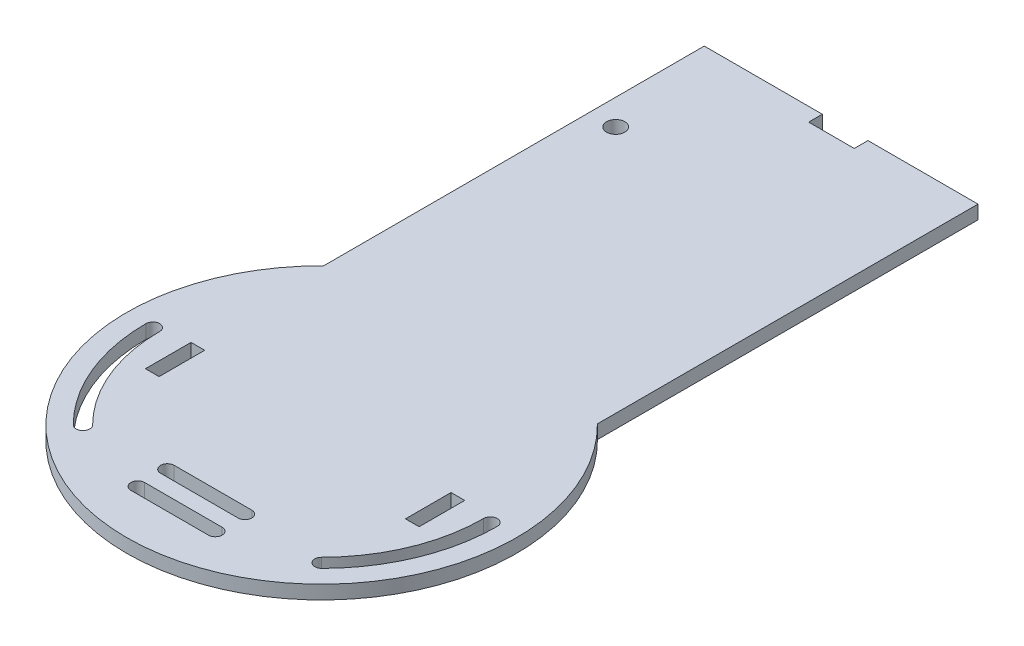
ISO-10303-21;
HEADER;
FILE_DESCRIPTION(('STEP AP214'),'2;1');
FILE_NAME('part.step','',(''),(''),'','','');
FILE_SCHEMA(('AUTOMOTIVE_DESIGN { 1 0 10303 214 1 1 1 1 }'));
ENDSEC;
DATA;
#1=APPLICATION_CONTEXT('core data for automotive mechanical design processes');
#2=APPLICATION_PROTOCOL_DEFINITION('international standard','automotive_design',2000,#1);
#3=PRODUCT_CONTEXT('',#1,'mechanical');
#4=PRODUCT('Part','Part','',(#3));
#5=PRODUCT_RELATED_PRODUCT_CATEGORY('part','',(#4));
#6=PRODUCT_DEFINITION_FORMATION('','',#4);
#7=PRODUCT_DEFINITION_CONTEXT('part definition',#1,'design');
#8=PRODUCT_DEFINITION('design','',#6,#7);
#9=PRODUCT_DEFINITION_SHAPE('','',#8);
#10=(LENGTH_UNIT() NAMED_UNIT(*) SI_UNIT(.MILLI.,.METRE.));
#11=(NAMED_UNIT(*) PLANE_ANGLE_UNIT() SI_UNIT($,.RADIAN.));
#12=(NAMED_UNIT(*) SI_UNIT($,.STERADIAN.) SOLID_ANGLE_UNIT());
#13=UNCERTAINTY_MEASURE_WITH_UNIT(LENGTH_MEASURE(1.E-05),#10,'distance_accuracy_value','');
#14=(GEOMETRIC_REPRESENTATION_CONTEXT(3) GLOBAL_UNCERTAINTY_ASSIGNED_CONTEXT((#13)) GLOBAL_UNIT_ASSIGNED_CONTEXT((#10,
#11,#12)) REPRESENTATION_CONTEXT('',''));
#15=CARTESIAN_POINT('',(0.,0.,0.));
#16=DIRECTION('',(0.,0.,1.));
#17=DIRECTION('',(1.,0.,0.));
#18=AXIS2_PLACEMENT_3D('',#15,#16,#17);
#19=CARTESIAN_POINT('',(0.0548478255462024,3.,51.3690634828703));
#20=DIRECTION('',(0.,1.,0.));
#21=DIRECTION('',(0.,0.,1.));
#22=AXIS2_PLACEMENT_3D('',#19,#20,#21);
#23=PLANE('',#22);
#24=CARTESIAN_POINT('',(0.0548478255462024,3.,51.3690634828703));
#25=DIRECTION('',(0.,1.,0.));
#26=DIRECTION('',(0.,0.,1.));
#27=AXIS2_PLACEMENT_3D('',#24,#25,#26);
#28=CIRCLE('',#27,38.5);
#29=CARTESIAN_POINT('',(27.2784589012284,3.,78.5926745585523));
#30=VERTEX_POINT('',#29);
#31=CARTESIAN_POINT('',(38.5548478255462,3.,51.3690634828703));
#32=VERTEX_POINT('',#31);
#33=EDGE_CURVE('E348',#30,#32,#28,.T.);
#34=ORIENTED_EDGE('',*,*,#33,.F.);
#35=CARTESIAN_POINT('',(26.2177987294486,3.,77.5320143867724));
#36=DIRECTION('',(0.,1.,0.));
#37=DIRECTION('',(0.,0.,1.));
#38=AXIS2_PLACEMENT_3D('',#35,#36,#37);
#39=CIRCLE('',#38,1.5);
#40=CARTESIAN_POINT('',(25.1571385576688,3.,76.4713542149926));
#41=VERTEX_POINT('',#40);
#42=EDGE_CURVE('E346',#41,#30,#39,.T.);
#43=ORIENTED_EDGE('',*,*,#42,.F.);
#44=CARTESIAN_POINT('',(0.0548478255462024,3.,51.3690634828703));
#45=DIRECTION('',(0.,-1.,0.));
#46=DIRECTION('',(0.,0.,1.));
#47=AXIS2_PLACEMENT_3D('',#44,#45,#46);
#48=CIRCLE('',#47,35.5);
#49=CARTESIAN_POINT('',(35.5548478255462,3.,51.3690634828703));
#50=VERTEX_POINT('',#49);
#51=EDGE_CURVE('E354',#50,#41,#48,.T.);
#52=ORIENTED_EDGE('',*,*,#51,.F.);
#53=CARTESIAN_POINT('',(37.0548478255462,3.,51.3690634828703));
#54=DIRECTION('',(0.,1.,0.));
#55=DIRECTION('',(0.,0.,1.));
#56=AXIS2_PLACEMENT_3D('',#53,#54,#55);
#57=CIRCLE('',#56,1.5);
#58=EDGE_CURVE('E351',#32,#50,#57,.T.);
#59=ORIENTED_EDGE('',*,*,#58,.F.);
#60=EDGE_LOOP('',(#34,#43,#52,#59));
#61=FACE_BOUND('',#60,.T.);
#62=DIRECTION('',(0.,0.,-1.));
#63=VECTOR('',#62,1.);
#64=CARTESIAN_POINT('',(-26.9451521744538,3.,60.));
#65=LINE('',#64,#63);
#66=CARTESIAN_POINT('',(-26.9451521744538,3.,60.));
#67=VERTEX_POINT('',#66);
#68=CARTESIAN_POINT('',(-26.9451521744538,3.,50.));
#69=VERTEX_POINT('',#68);
#70=EDGE_CURVE('E379',#67,#69,#65,.T.);
#71=ORIENTED_EDGE('',*,*,#70,.F.);
#72=DIRECTION('',(1.,0.,0.));
#73=VECTOR('',#72,1.);
#74=CARTESIAN_POINT('',(-26.9451521744538,3.,60.));
#75=LINE('',#74,#73);
#76=CARTESIAN_POINT('',(-29.9451521744538,3.,60.));
#77=VERTEX_POINT('',#76);
#78=EDGE_CURVE('E377',#77,#67,#75,.T.);
#79=ORIENTED_EDGE('',*,*,#78,.F.);
#80=DIRECTION('',(0.,0.,1.));
#81=VECTOR('',#80,1.);
#82=CARTESIAN_POINT('',(-29.9451521744538,3.,60.));
#83=LINE('',#82,#81);
#84=CARTESIAN_POINT('',(-29.9451521744538,3.,50.));
#85=VERTEX_POINT('',#84);
#86=EDGE_CURVE('E385',#85,#77,#83,.T.);
#87=ORIENTED_EDGE('',*,*,#86,.F.);
#88=DIRECTION('',(-1.,0.,0.));
#89=VECTOR('',#88,1.);
#90=CARTESIAN_POINT('',(-26.9451521744538,3.,50.));
#91=LINE('',#90,#89);
#92=EDGE_CURVE('E382',#69,#85,#91,.T.);
#93=ORIENTED_EDGE('',*,*,#92,.F.);
#94=EDGE_LOOP('',(#71,#79,#87,#93));
#95=FACE_BOUND('',#94,.T.);
#96=DIRECTION('',(-1.,0.,0.));
#97=VECTOR('',#96,1.);
#98=CARTESIAN_POINT('',(30.0548478255454,3.,50.));
#99=LINE('',#98,#97);
#100=CARTESIAN_POINT('',(30.0548478255454,3.,50.));
#101=VERTEX_POINT('',#100);
#102=CARTESIAN_POINT('',(27.0548478255454,3.,50.));
#103=VERTEX_POINT('',#102);
#104=EDGE_CURVE('E410',#101,#103,#99,.T.);
#105=ORIENTED_EDGE('',*,*,#104,.F.);
#106=DIRECTION('',(0.,0.,-1.));
#107=VECTOR('',#106,1.);
#108=CARTESIAN_POINT('',(30.0548478255454,3.,60.));
#109=LINE('',#108,#107);
#110=CARTESIAN_POINT('',(30.0548478255454,3.,60.));
#111=VERTEX_POINT('',#110);
#112=EDGE_CURVE('E408',#111,#101,#109,.T.);
#113=ORIENTED_EDGE('',*,*,#112,.F.);
#114=DIRECTION('',(1.,0.,0.));
#115=VECTOR('',#114,1.);
#116=CARTESIAN_POINT('',(30.0548478255454,3.,60.));
#117=LINE('',#116,#115);
#118=CARTESIAN_POINT('',(27.0548478255454,3.,60.));
#119=VERTEX_POINT('',#118);
#120=EDGE_CURVE('E416',#119,#111,#117,.T.);
#121=ORIENTED_EDGE('',*,*,#120,.F.);
#122=DIRECTION('',(0.,0.,1.));
#123=VECTOR('',#122,1.);
#124=CARTESIAN_POINT('',(27.0548478255454,3.,60.));
#125=LINE('',#124,#123);
#126=EDGE_CURVE('E413',#103,#119,#125,.T.);
#127=ORIENTED_EDGE('',*,*,#126,.F.);
#128=EDGE_LOOP('',(#105,#113,#121,#127));
#129=FACE_BOUND('',#128,.T.);
#130=DIRECTION('',(-1.,0.,0.));
#131=VECTOR('',#130,1.);
#132=CARTESIAN_POINT('',(5.93086457862568,3.,-62.5));
#133=LINE('',#132,#131);
#134=CARTESIAN_POINT('',(30.0548478255462,3.,-62.5));
#135=VERTEX_POINT('',#134);
#136=CARTESIAN_POINT('',(5.93086457862568,3.,-62.5));
#137=VERTEX_POINT('',#136);
#138=EDGE_CURVE('E439',#135,#137,#133,.T.);
#139=ORIENTED_EDGE('',*,*,#138,.T.);
#140=DIRECTION('',(0.,0.,1.));
#141=VECTOR('',#140,1.);
#142=CARTESIAN_POINT('',(5.93086457862568,3.,-62.5));
#143=LINE('',#142,#141);
#144=CARTESIAN_POINT('',(5.93086457862568,3.,-59.5));
#145=VERTEX_POINT('',#144);
#146=EDGE_CURVE('E442',#137,#145,#143,.T.);
#147=ORIENTED_EDGE('',*,*,#146,.T.);
#148=DIRECTION('',(-1.,0.,0.));
#149=VECTOR('',#148,1.);
#150=CARTESIAN_POINT('',(5.93086457862568,3.,-59.5));
#151=LINE('',#150,#149);
#152=CARTESIAN_POINT('',(-4.0691354213743,3.,-59.5));
#153=VERTEX_POINT('',#152);
#154=EDGE_CURVE('E445',#145,#153,#151,.T.);
#155=ORIENTED_EDGE('',*,*,#154,.T.);
#156=DIRECTION('',(0.,0.,-1.));
#157=VECTOR('',#156,1.);
#158=CARTESIAN_POINT('',(-4.0691354213743,3.,-62.5));
#159=LINE('',#158,#157);
#160=CARTESIAN_POINT('',(-4.0691354213743,3.,-62.5));
#161=VERTEX_POINT('',#160);
#162=EDGE_CURVE('E447',#153,#161,#159,.T.);
#163=ORIENTED_EDGE('',*,*,#162,.T.);
#164=DIRECTION('',(-1.,0.,0.));
#165=VECTOR('',#164,1.);
#166=CARTESIAN_POINT('',(-29.9451521744538,3.,-62.5));
#167=LINE('',#166,#165);
#168=CARTESIAN_POINT('',(-29.9451521744538,3.,-62.5));
#169=VERTEX_POINT('',#168);
#170=EDGE_CURVE('E449',#161,#169,#167,.T.);
#171=ORIENTED_EDGE('',*,*,#170,.T.);
#172=DIRECTION('',(0.,0.,1.));
#173=VECTOR('',#172,1.);
#174=CARTESIAN_POINT('',(-29.9451521744538,3.,20.9241988671145));
#175=LINE('',#174,#173);
#176=CARTESIAN_POINT('',(-29.9451521744538,3.,20.9241988671145));
#177=VERTEX_POINT('',#176);
#178=EDGE_CURVE('E451',#169,#177,#175,.T.);
#179=ORIENTED_EDGE('',*,*,#178,.T.);
#180=CARTESIAN_POINT('',(0.0548478255462024,3.,51.3690634828703));
#181=DIRECTION('',(0.,1.,0.));
#182=DIRECTION('',(0.,0.,1.));
#183=AXIS2_PLACEMENT_3D('',#180,#181,#182);
#184=CIRCLE('',#183,42.7421312228544);
#185=CARTESIAN_POINT('',(30.0548478255462,3.,20.9241988671145));
#186=VERTEX_POINT('',#185);
#187=EDGE_CURVE('E453',#177,#186,#184,.T.);
#188=ORIENTED_EDGE('',*,*,#187,.T.);
#189=DIRECTION('',(0.,0.,-1.));
#190=VECTOR('',#189,1.);
#191=CARTESIAN_POINT('',(30.0548478255462,3.,20.9241988671145));
#192=LINE('',#191,#190);
#193=EDGE_CURVE('E455',#186,#135,#192,.T.);
#194=ORIENTED_EDGE('',*,*,#193,.T.);
#195=EDGE_LOOP('',(#139,#147,#155,#163,#171,#179,#188,#194));
#196=FACE_BOUND('',#195,.T.);
#197=CARTESIAN_POINT('',(-24.3,3.,-37.4391816326505));
#198=DIRECTION('',(0.,1.,0.));
#199=DIRECTION('',(0.,0.,1.));
#200=AXIS2_PLACEMENT_3D('',#197,#198,#199);
#201=CIRCLE('',#200,2.);
#202=CARTESIAN_POINT('',(-24.3,3.,-35.4391816326505));
#203=VERTEX_POINT('',#202);
#204=EDGE_CURVE('E340',#203,#203,#201,.T.);
#205=ORIENTED_EDGE('',*,*,#204,.F.);
#206=EDGE_LOOP('',(#205));
#207=FACE_BOUND('',#206,.T.);
#208=CARTESIAN_POINT('',(0.0548478255462024,3.,51.3690634828703));
#209=DIRECTION('',(0.,-1.,0.));
#210=DIRECTION('',(0.,0.,1.));
#211=AXIS2_PLACEMENT_3D('',#208,#209,#210);
#212=CIRCLE('',#211,35.5);
#213=CARTESIAN_POINT('',(-25.0474429065764,3.,76.4713542149926));
#214=VERTEX_POINT('',#213);
#215=CARTESIAN_POINT('',(-35.4451521744538,3.,51.3690634828703));
#216=VERTEX_POINT('',#215);
#217=EDGE_CURVE('E311',#214,#216,#212,.T.);
#218=ORIENTED_EDGE('',*,*,#217,.F.);
#219=CARTESIAN_POINT('',(-26.1081030783562,3.,77.5320143867724));
#220=DIRECTION('',(0.,1.,0.));
#221=DIRECTION('',(0.,0.,1.));
#222=AXIS2_PLACEMENT_3D('',#219,#220,#221);
#223=CIRCLE('',#222,1.5);
#224=CARTESIAN_POINT('',(-27.168763250136,3.,78.5926745585522));
#225=VERTEX_POINT('',#224);
#226=EDGE_CURVE('E309',#225,#214,#223,.T.);
#227=ORIENTED_EDGE('',*,*,#226,.F.);
#228=CARTESIAN_POINT('',(0.0548478255462024,3.,51.3690634828703));
#229=DIRECTION('',(0.,1.,0.));
#230=DIRECTION('',(0.,0.,1.));
#231=AXIS2_PLACEMENT_3D('',#228,#229,#230);
#232=CIRCLE('',#231,38.5);
#233=CARTESIAN_POINT('',(-38.4451521744538,3.,51.3690634828703));
#234=VERTEX_POINT('',#233);
#235=EDGE_CURVE('E317',#234,#225,#232,.T.);
#236=ORIENTED_EDGE('',*,*,#235,.F.);
#237=CARTESIAN_POINT('',(-36.9451521744538,3.,51.3690634828703));
#238=DIRECTION('',(0.,1.,0.));
#239=DIRECTION('',(0.,0.,1.));
#240=AXIS2_PLACEMENT_3D('',#237,#238,#239);
#241=CIRCLE('',#240,1.5);
#242=EDGE_CURVE('E314',#216,#234,#241,.T.);
#243=ORIENTED_EDGE('',*,*,#242,.F.);
#244=EDGE_LOOP('',(#218,#227,#236,#243));
#245=FACE_BOUND('',#244,.T.);
#246=DIRECTION('',(-1.,0.,0.));
#247=VECTOR('',#246,1.);
#248=CARTESIAN_POINT('',(8.55484782554621,3.,81.6826233576801));
#249=LINE('',#248,#247);
#250=CARTESIAN_POINT('',(8.55484782554621,3.,81.6826233576801));
#251=VERTEX_POINT('',#250);
#252=CARTESIAN_POINT('',(-8.4451521744538,3.,81.6826233576801));
#253=VERTEX_POINT('',#252);
#254=EDGE_CURVE('E280',#251,#253,#249,.T.);
#255=ORIENTED_EDGE('',*,*,#254,.F.);
#256=CARTESIAN_POINT('',(8.5548478255462,3.,83.1826233576801));
#257=DIRECTION('',(0.,1.,0.));
#258=DIRECTION('',(0.,0.,1.));
#259=AXIS2_PLACEMENT_3D('',#256,#257,#258);
#260=CIRCLE('',#259,1.5);
#261=CARTESIAN_POINT('',(8.55484782554621,3.,84.6826233576801));
#262=VERTEX_POINT('',#261);
#263=EDGE_CURVE('E278',#262,#251,#260,.T.);
#264=ORIENTED_EDGE('',*,*,#263,.F.);
#265=DIRECTION('',(1.,0.,0.));
#266=VECTOR('',#265,1.);
#267=CARTESIAN_POINT('',(-8.4451521744538,3.,84.6826233576801));
#268=LINE('',#267,#266);
#269=CARTESIAN_POINT('',(-8.4451521744538,3.,84.6826233576801));
#270=VERTEX_POINT('',#269);
#271=EDGE_CURVE('E286',#270,#262,#268,.T.);
#272=ORIENTED_EDGE('',*,*,#271,.F.);
#273=CARTESIAN_POINT('',(-8.4451521744538,3.,83.1826233576801));
#274=DIRECTION('',(0.,1.,0.));
#275=DIRECTION('',(0.,0.,1.));
#276=AXIS2_PLACEMENT_3D('',#273,#274,#275);
#277=CIRCLE('',#276,1.5);
#278=EDGE_CURVE('E283',#253,#270,#277,.T.);
#279=ORIENTED_EDGE('',*,*,#278,.F.);
#280=EDGE_LOOP('',(#255,#264,#272,#279));
#281=FACE_BOUND('',#280,.T.);
#282=DIRECTION('',(-1.,0.,0.));
#283=VECTOR('',#282,1.);
#284=CARTESIAN_POINT('',(8.55484782554621,3.,75.1826233576801));
#285=LINE('',#284,#283);
#286=CARTESIAN_POINT('',(8.55484782554621,3.,75.1826233576801));
#287=VERTEX_POINT('',#286);
#288=CARTESIAN_POINT('',(-8.44515217445379,3.,75.1826233576801));
#289=VERTEX_POINT('',#288);
#290=EDGE_CURVE('E250',#287,#289,#285,.T.);
#291=ORIENTED_EDGE('',*,*,#290,.F.);
#292=CARTESIAN_POINT('',(8.55484782554621,3.,76.6826233576801));
#293=DIRECTION('',(0.,1.,0.));
#294=DIRECTION('',(0.,0.,1.));
#295=AXIS2_PLACEMENT_3D('',#292,#293,#294);
#296=CIRCLE('',#295,1.5);
#297=CARTESIAN_POINT('',(8.55484782554621,3.,78.1826233576801));
#298=VERTEX_POINT('',#297);
#299=EDGE_CURVE('E242',#298,#287,#296,.T.);
#300=ORIENTED_EDGE('',*,*,#299,.F.);
#301=DIRECTION('',(1.,0.,0.));
#302=VECTOR('',#301,1.);
#303=CARTESIAN_POINT('',(-8.44515217445379,3.,78.1826233576801));
#304=LINE('',#303,#302);
#305=CARTESIAN_POINT('',(-8.44515217445379,3.,78.1826233576801));
#306=VERTEX_POINT('',#305);
#307=EDGE_CURVE('E264',#306,#298,#304,.T.);
#308=ORIENTED_EDGE('',*,*,#307,.F.);
#309=CARTESIAN_POINT('',(-8.44515217445379,3.,76.6826233576801));
#310=DIRECTION('',(0.,1.,0.));
#311=DIRECTION('',(0.,0.,1.));
#312=AXIS2_PLACEMENT_3D('',#309,#310,#311);
#313=CIRCLE('',#312,1.5);
#314=EDGE_CURVE('E262',#289,#306,#313,.T.);
#315=ORIENTED_EDGE('',*,*,#314,.F.);
#316=EDGE_LOOP('',(#291,#300,#308,#315));
#317=FACE_BOUND('',#316,.T.);
#318=ADVANCED_FACE('F33',(#61,#95,#129,#196,#207,#245,#281,#317),#23,.T.);
#319=CARTESIAN_POINT('',(0.0548478255462024,0.,51.3690634828703));
#320=DIRECTION('',(0.,1.,0.));
#321=DIRECTION('',(0.,0.,1.));
#322=AXIS2_PLACEMENT_3D('',#319,#320,#321);
#323=PLANE('',#322);
#324=CARTESIAN_POINT('',(8.5548478255462,0.,83.1826233576801));
#325=DIRECTION('',(0.,1.,0.));
#326=DIRECTION('',(0.,0.,1.));
#327=AXIS2_PLACEMENT_3D('',#324,#325,#326);
#328=CIRCLE('',#327,1.5);
#329=CARTESIAN_POINT('',(8.55484782554621,0.,84.6826233576801));
#330=VERTEX_POINT('',#329);
#331=CARTESIAN_POINT('',(8.55484782554621,0.,81.6826233576801));
#332=VERTEX_POINT('',#331);
#333=EDGE_CURVE('E258',#330,#332,#328,.T.);
#334=ORIENTED_EDGE('',*,*,#333,.T.);
#335=DIRECTION('',(-1.,0.,0.));
#336=VECTOR('',#335,1.);
#337=CARTESIAN_POINT('',(8.55484782554621,0.,81.6826233576801));
#338=LINE('',#337,#336);
#339=CARTESIAN_POINT('',(-8.4451521744538,0.,81.6826233576801));
#340=VERTEX_POINT('',#339);
#341=EDGE_CURVE('E291',#332,#340,#338,.T.);
#342=ORIENTED_EDGE('',*,*,#341,.T.);
#343=CARTESIAN_POINT('',(-8.4451521744538,0.,83.1826233576801));
#344=DIRECTION('',(0.,1.,0.));
#345=DIRECTION('',(0.,0.,1.));
#346=AXIS2_PLACEMENT_3D('',#343,#344,#345);
#347=CIRCLE('',#346,1.5);
#348=CARTESIAN_POINT('',(-8.4451521744538,0.,84.6826233576801));
#349=VERTEX_POINT('',#348);
#350=EDGE_CURVE('E294',#340,#349,#347,.T.);
#351=ORIENTED_EDGE('',*,*,#350,.T.);
#352=DIRECTION('',(1.,0.,0.));
#353=VECTOR('',#352,1.);
#354=CARTESIAN_POINT('',(-8.4451521744538,0.,84.6826233576801));
#355=LINE('',#354,#353);
#356=EDGE_CURVE('E281',#349,#330,#355,.T.);
#357=ORIENTED_EDGE('',*,*,#356,.T.);
#358=EDGE_LOOP('',(#334,#342,#351,#357));
#359=FACE_BOUND('',#358,.T.);
#360=CARTESIAN_POINT('',(-24.3,0.,-37.4391816326505));
#361=DIRECTION('',(0.,1.,0.));
#362=DIRECTION('',(0.,0.,1.));
#363=AXIS2_PLACEMENT_3D('',#360,#361,#362);
#364=CIRCLE('',#363,2.);
#365=CARTESIAN_POINT('',(-24.3,0.,-35.4391816326505));
#366=VERTEX_POINT('',#365);
#367=EDGE_CURVE('E339',#366,#366,#364,.T.);
#368=ORIENTED_EDGE('',*,*,#367,.T.);
#369=EDGE_LOOP('',(#368));
#370=FACE_BOUND('',#369,.T.);
#371=CARTESIAN_POINT('',(26.2177987294486,0.,77.5320143867724));
#372=DIRECTION('',(0.,1.,0.));
#373=DIRECTION('',(0.,0.,1.));
#374=AXIS2_PLACEMENT_3D('',#371,#372,#373);
#375=CIRCLE('',#374,1.5);
#376=CARTESIAN_POINT('',(25.1571385576688,0.,76.4713542149926));
#377=VERTEX_POINT('',#376);
#378=CARTESIAN_POINT('',(27.2784589012284,0.,78.5926745585523));
#379=VERTEX_POINT('',#378);
#380=EDGE_CURVE('E343',#377,#379,#375,.T.);
#381=ORIENTED_EDGE('',*,*,#380,.T.);
#382=CARTESIAN_POINT('',(0.0548478255462024,0.,51.3690634828703));
#383=DIRECTION('',(0.,1.,0.));
#384=DIRECTION('',(0.,0.,1.));
#385=AXIS2_PLACEMENT_3D('',#382,#383,#384);
#386=CIRCLE('',#385,38.5);
#387=CARTESIAN_POINT('',(38.5548478255462,0.,51.3690634828703));
#388=VERTEX_POINT('',#387);
#389=EDGE_CURVE('E359',#379,#388,#386,.T.);
#390=ORIENTED_EDGE('',*,*,#389,.T.);
#391=CARTESIAN_POINT('',(37.0548478255462,0.,51.3690634828703));
#392=DIRECTION('',(0.,1.,0.));
#393=DIRECTION('',(0.,0.,1.));
#394=AXIS2_PLACEMENT_3D('',#391,#392,#393);
#395=CIRCLE('',#394,1.5);
#396=CARTESIAN_POINT('',(35.5548478255462,0.,51.3690634828703));
#397=VERTEX_POINT('',#396);
#398=EDGE_CURVE('E362',#388,#397,#395,.T.);
#399=ORIENTED_EDGE('',*,*,#398,.T.);
#400=CARTESIAN_POINT('',(0.0548478255462024,0.,51.3690634828703));
#401=DIRECTION('',(0.,-1.,0.));
#402=DIRECTION('',(0.,0.,1.));
#403=AXIS2_PLACEMENT_3D('',#400,#401,#402);
#404=CIRCLE('',#403,35.5);
#405=EDGE_CURVE('E349',#397,#377,#404,.T.);
#406=ORIENTED_EDGE('',*,*,#405,.T.);
#407=EDGE_LOOP('',(#381,#390,#399,#406));
#408=FACE_BOUND('',#407,.T.);
#409=DIRECTION('',(0.,0.,-1.));
#410=VECTOR('',#409,1.);
#411=CARTESIAN_POINT('',(30.0548478255454,0.,60.));
#412=LINE('',#411,#410);
#413=CARTESIAN_POINT('',(30.0548478255454,0.,60.));
#414=VERTEX_POINT('',#413);
#415=CARTESIAN_POINT('',(30.0548478255454,0.,50.));
#416=VERTEX_POINT('',#415);
#417=EDGE_CURVE('E407',#414,#416,#412,.T.);
#418=ORIENTED_EDGE('',*,*,#417,.T.);
#419=DIRECTION('',(-1.,0.,0.));
#420=VECTOR('',#419,1.);
#421=CARTESIAN_POINT('',(30.0548478255454,0.,50.));
#422=LINE('',#421,#420);
#423=CARTESIAN_POINT('',(27.0548478255454,0.,50.));
#424=VERTEX_POINT('',#423);
#425=EDGE_CURVE('E421',#416,#424,#422,.T.);
#426=ORIENTED_EDGE('',*,*,#425,.T.);
#427=DIRECTION('',(0.,0.,1.));
#428=VECTOR('',#427,1.);
#429=CARTESIAN_POINT('',(27.0548478255454,0.,60.));
#430=LINE('',#429,#428);
#431=CARTESIAN_POINT('',(27.0548478255454,0.,60.));
#432=VERTEX_POINT('',#431);
#433=EDGE_CURVE('E424',#424,#432,#430,.T.);
#434=ORIENTED_EDGE('',*,*,#433,.T.);
#435=DIRECTION('',(1.,0.,0.));
#436=VECTOR('',#435,1.);
#437=CARTESIAN_POINT('',(30.0548478255454,0.,60.));
#438=LINE('',#437,#436);
#439=EDGE_CURVE('E411',#432,#414,#438,.T.);
#440=ORIENTED_EDGE('',*,*,#439,.T.);
#441=EDGE_LOOP('',(#418,#426,#434,#440));
#442=FACE_BOUND('',#441,.T.);
#443=DIRECTION('',(-1.,0.,0.));
#444=VECTOR('',#443,1.);
#445=CARTESIAN_POINT('',(5.93086457862568,0.,-62.5));
#446=LINE('',#445,#444);
#447=CARTESIAN_POINT('',(30.0548478255462,0.,-62.5));
#448=VERTEX_POINT('',#447);
#449=CARTESIAN_POINT('',(5.93086457862568,0.,-62.5));
#450=VERTEX_POINT('',#449);
#451=EDGE_CURVE('E438',#448,#450,#446,.T.);
#452=ORIENTED_EDGE('',*,*,#451,.F.);
#453=DIRECTION('',(0.,0.,-1.));
#454=VECTOR('',#453,1.);
#455=CARTESIAN_POINT('',(30.0548478255462,0.,20.9241988671145));
#456=LINE('',#455,#454);
#457=CARTESIAN_POINT('',(30.0548478255462,0.,20.9241988671145));
#458=VERTEX_POINT('',#457);
#459=EDGE_CURVE('E443',#458,#448,#456,.T.);
#460=ORIENTED_EDGE('',*,*,#459,.F.);
#461=CARTESIAN_POINT('',(0.0548478255462024,0.,51.3690634828703));
#462=DIRECTION('',(0.,1.,0.));
#463=DIRECTION('',(0.,0.,1.));
#464=AXIS2_PLACEMENT_3D('',#461,#462,#463);
#465=CIRCLE('',#464,42.7421312228544);
#466=CARTESIAN_POINT('',(-29.9451521744538,0.,20.9241988671145));
#467=VERTEX_POINT('',#466);
#468=EDGE_CURVE('E470',#467,#458,#465,.T.);
#469=ORIENTED_EDGE('',*,*,#468,.F.);
#470=DIRECTION('',(0.,0.,1.));
#471=VECTOR('',#470,1.);
#472=CARTESIAN_POINT('',(-29.9451521744538,0.,20.9241988671145));
#473=LINE('',#472,#471);
#474=CARTESIAN_POINT('',(-29.9451521744538,0.,-62.5));
#475=VERTEX_POINT('',#474);
#476=EDGE_CURVE('E468',#475,#467,#473,.T.);
#477=ORIENTED_EDGE('',*,*,#476,.F.);
#478=DIRECTION('',(-1.,0.,0.));
#479=VECTOR('',#478,1.);
#480=CARTESIAN_POINT('',(-29.9451521744538,0.,-62.5));
#481=LINE('',#480,#479);
#482=CARTESIAN_POINT('',(-4.0691354213743,0.,-62.5));
#483=VERTEX_POINT('',#482);
#484=EDGE_CURVE('E466',#483,#475,#481,.T.);
#485=ORIENTED_EDGE('',*,*,#484,.F.);
#486=DIRECTION('',(0.,0.,-1.));
#487=VECTOR('',#486,1.);
#488=CARTESIAN_POINT('',(-4.0691354213743,0.,-62.5));
#489=LINE('',#488,#487);
#490=CARTESIAN_POINT('',(-4.0691354213743,0.,-59.5));
#491=VERTEX_POINT('',#490);
#492=EDGE_CURVE('E464',#491,#483,#489,.T.);
#493=ORIENTED_EDGE('',*,*,#492,.F.);
#494=DIRECTION('',(-1.,0.,0.));
#495=VECTOR('',#494,1.);
#496=CARTESIAN_POINT('',(5.93086457862568,0.,-59.5));
#497=LINE('',#496,#495);
#498=CARTESIAN_POINT('',(5.93086457862568,0.,-59.5));
#499=VERTEX_POINT('',#498);
#500=EDGE_CURVE('E462',#499,#491,#497,.T.);
#501=ORIENTED_EDGE('',*,*,#500,.F.);
#502=DIRECTION('',(0.,0.,1.));
#503=VECTOR('',#502,1.);
#504=CARTESIAN_POINT('',(5.93086457862568,0.,-62.5));
#505=LINE('',#504,#503);
#506=EDGE_CURVE('E460',#450,#499,#505,.T.);
#507=ORIENTED_EDGE('',*,*,#506,.F.);
#508=EDGE_LOOP('',(#452,#460,#469,#477,#485,#493,#501,#507));
#509=FACE_BOUND('',#508,.T.);
#510=DIRECTION('',(1.,0.,0.));
#511=VECTOR('',#510,1.);
#512=CARTESIAN_POINT('',(-26.9451521744538,0.,60.));
#513=LINE('',#512,#511);
#514=CARTESIAN_POINT('',(-29.9451521744538,0.,60.));
#515=VERTEX_POINT('',#514);
#516=CARTESIAN_POINT('',(-26.9451521744538,0.,60.));
#517=VERTEX_POINT('',#516);
#518=EDGE_CURVE('E376',#515,#517,#513,.T.);
#519=ORIENTED_EDGE('',*,*,#518,.T.);
#520=DIRECTION('',(0.,0.,-1.));
#521=VECTOR('',#520,1.);
#522=CARTESIAN_POINT('',(-26.9451521744538,0.,60.));
#523=LINE('',#522,#521);
#524=CARTESIAN_POINT('',(-26.9451521744538,0.,50.));
#525=VERTEX_POINT('',#524);
#526=EDGE_CURVE('E390',#517,#525,#523,.T.);
#527=ORIENTED_EDGE('',*,*,#526,.T.);
#528=DIRECTION('',(-1.,0.,0.));
#529=VECTOR('',#528,1.);
#530=CARTESIAN_POINT('',(-26.9451521744538,0.,50.));
#531=LINE('',#530,#529);
#532=CARTESIAN_POINT('',(-29.9451521744538,0.,50.));
#533=VERTEX_POINT('',#532);
#534=EDGE_CURVE('E393',#525,#533,#531,.T.);
#535=ORIENTED_EDGE('',*,*,#534,.T.);
#536=DIRECTION('',(0.,0.,1.));
#537=VECTOR('',#536,1.);
#538=CARTESIAN_POINT('',(-29.9451521744538,0.,60.));
#539=LINE('',#538,#537);
#540=EDGE_CURVE('E380',#533,#515,#539,.T.);
#541=ORIENTED_EDGE('',*,*,#540,.T.);
#542=EDGE_LOOP('',(#519,#527,#535,#541));
#543=FACE_BOUND('',#542,.T.);
#544=CARTESIAN_POINT('',(-26.1081030783562,0.,77.5320143867724));
#545=DIRECTION('',(0.,1.,0.));
#546=DIRECTION('',(0.,0.,1.));
#547=AXIS2_PLACEMENT_3D('',#544,#545,#546);
#548=CIRCLE('',#547,1.5);
#549=CARTESIAN_POINT('',(-27.168763250136,0.,78.5926745585522));
#550=VERTEX_POINT('',#549);
#551=CARTESIAN_POINT('',(-25.0474429065764,0.,76.4713542149926));
#552=VERTEX_POINT('',#551);
#553=EDGE_CURVE('E308',#550,#552,#548,.T.);
#554=ORIENTED_EDGE('',*,*,#553,.T.);
#555=CARTESIAN_POINT('',(0.0548478255462024,0.,51.3690634828703));
#556=DIRECTION('',(0.,-1.,0.));
#557=DIRECTION('',(0.,0.,1.));
#558=AXIS2_PLACEMENT_3D('',#555,#556,#557);
#559=CIRCLE('',#558,35.5);
#560=CARTESIAN_POINT('',(-35.4451521744538,0.,51.3690634828703));
#561=VERTEX_POINT('',#560);
#562=EDGE_CURVE('E322',#552,#561,#559,.T.);
#563=ORIENTED_EDGE('',*,*,#562,.T.);
#564=CARTESIAN_POINT('',(-36.9451521744538,0.,51.3690634828703));
#565=DIRECTION('',(0.,1.,0.));
#566=DIRECTION('',(0.,0.,1.));
#567=AXIS2_PLACEMENT_3D('',#564,#565,#566);
#568=CIRCLE('',#567,1.5);
#569=CARTESIAN_POINT('',(-38.4451521744538,0.,51.3690634828703));
#570=VERTEX_POINT('',#569);
#571=EDGE_CURVE('E325',#561,#570,#568,.T.);
#572=ORIENTED_EDGE('',*,*,#571,.T.);
#573=CARTESIAN_POINT('',(0.0548478255462024,0.,51.3690634828703));
#574=DIRECTION('',(0.,1.,0.));
#575=DIRECTION('',(0.,0.,1.));
#576=AXIS2_PLACEMENT_3D('',#573,#574,#575);
#577=CIRCLE('',#576,38.5);
#578=EDGE_CURVE('E312',#570,#550,#577,.T.);
#579=ORIENTED_EDGE('',*,*,#578,.T.);
#580=EDGE_LOOP('',(#554,#563,#572,#579));
#581=FACE_BOUND('',#580,.T.);
#582=CARTESIAN_POINT('',(8.55484782554621,0.,76.6826233576801));
#583=DIRECTION('',(0.,1.,0.));
#584=DIRECTION('',(0.,0.,1.));
#585=AXIS2_PLACEMENT_3D('',#582,#583,#584);
#586=CIRCLE('',#585,1.5);
#587=CARTESIAN_POINT('',(8.55484782554621,0.,78.1826233576801));
#588=VERTEX_POINT('',#587);
#589=CARTESIAN_POINT('',(8.55484782554621,0.,75.1826233576801));
#590=VERTEX_POINT('',#589);
#591=EDGE_CURVE('E56',#588,#590,#586,.T.);
#592=ORIENTED_EDGE('',*,*,#591,.T.);
#593=DIRECTION('',(-1.,0.,0.));
#594=VECTOR('',#593,1.);
#595=CARTESIAN_POINT('',(8.55484782554621,0.,75.1826233576801));
#596=LINE('',#595,#594);
#597=CARTESIAN_POINT('',(-8.44515217445379,0.,75.1826233576801));
#598=VERTEX_POINT('',#597);
#599=EDGE_CURVE('E257',#590,#598,#596,.T.);
#600=ORIENTED_EDGE('',*,*,#599,.T.);
#601=CARTESIAN_POINT('',(-8.44515217445379,0.,76.6826233576801));
#602=DIRECTION('',(0.,1.,0.));
#603=DIRECTION('',(0.,0.,1.));
#604=AXIS2_PLACEMENT_3D('',#601,#602,#603);
#605=CIRCLE('',#604,1.5);
#606=CARTESIAN_POINT('',(-8.44515217445379,0.,78.1826233576801));
#607=VERTEX_POINT('',#606);
#608=EDGE_CURVE('E270',#598,#607,#605,.T.);
#609=ORIENTED_EDGE('',*,*,#608,.T.);
#610=DIRECTION('',(1.,0.,0.));
#611=VECTOR('',#610,1.);
#612=CARTESIAN_POINT('',(-8.44515217445379,0.,78.1826233576801));
#613=LINE('',#612,#611);
#614=EDGE_CURVE('E251',#607,#588,#613,.T.);
#615=ORIENTED_EDGE('',*,*,#614,.T.);
#616=EDGE_LOOP('',(#592,#600,#609,#615));
#617=FACE_BOUND('',#616,.T.);
#618=ADVANCED_FACE('F500',(#359,#370,#408,#442,#509,#543,#581,#617),#323,.F.);
#619=CARTESIAN_POINT('',(5.93086457862568,3.,-62.5));
#620=DIRECTION('',(0.,0.,1.));
#621=DIRECTION('',(1.,0.,0.));
#622=AXIS2_PLACEMENT_3D('',#619,#620,#621);
#623=PLANE('',#622);
#624=ORIENTED_EDGE('',*,*,#451,.T.);
#625=DIRECTION('',(0.,-1.,0.));
#626=VECTOR('',#625,1.);
#627=CARTESIAN_POINT('',(5.93086457862568,3.,-62.5));
#628=LINE('',#627,#626);
#629=EDGE_CURVE('E11',#137,#450,#628,.T.);
#630=ORIENTED_EDGE('',*,*,#629,.F.);
#631=ORIENTED_EDGE('',*,*,#138,.F.);
#632=DIRECTION('',(0.,-1.,0.));
#633=VECTOR('',#632,1.);
#634=CARTESIAN_POINT('',(30.0548478255462,3.,-62.5));
#635=LINE('',#634,#633);
#636=EDGE_CURVE('E457',#135,#448,#635,.T.);
#637=ORIENTED_EDGE('',*,*,#636,.T.);
#638=EDGE_LOOP('',(#624,#630,#631,#637));
#639=FACE_BOUND('',#638,.T.);
#640=ADVANCED_FACE('F35',(#639),#623,.F.);
#641=CARTESIAN_POINT('',(5.93086457862568,3.,-62.5));
#642=DIRECTION('',(1.,0.,0.));
#643=DIRECTION('',(0.,0.,-1.));
#644=AXIS2_PLACEMENT_3D('',#641,#642,#643);
#645=PLANE('',#644);
#646=ORIENTED_EDGE('',*,*,#506,.T.);
#647=DIRECTION('',(0.,-1.,0.));
#648=VECTOR('',#647,1.);
#649=CARTESIAN_POINT('',(5.93086457862568,3.,-59.5));
#650=LINE('',#649,#648);
#651=EDGE_CURVE('E41',#145,#499,#650,.T.);
#652=ORIENTED_EDGE('',*,*,#651,.F.);
#653=ORIENTED_EDGE('',*,*,#146,.F.);
#654=ORIENTED_EDGE('',*,*,#629,.T.);
#655=EDGE_LOOP('',(#646,#652,#653,#654));
#656=FACE_BOUND('',#655,.T.);
#657=ADVANCED_FACE('F518',(#656),#645,.F.);
#658=CARTESIAN_POINT('',(5.93086457862568,3.,-59.5));
#659=DIRECTION('',(0.,0.,1.));
#660=DIRECTION('',(1.,0.,0.));
#661=AXIS2_PLACEMENT_3D('',#658,#659,#660);
#662=PLANE('',#661);
#663=ORIENTED_EDGE('',*,*,#500,.T.);
#664=DIRECTION('',(0.,-1.,0.));
#665=VECTOR('',#664,1.);
#666=CARTESIAN_POINT('',(-4.0691354213743,3.,-59.5));
#667=LINE('',#666,#665);
#668=EDGE_CURVE('E487',#153,#491,#667,.T.);
#669=ORIENTED_EDGE('',*,*,#668,.F.);
#670=ORIENTED_EDGE('',*,*,#154,.F.);
#671=ORIENTED_EDGE('',*,*,#651,.T.);
#672=EDGE_LOOP('',(#663,#669,#670,#671));
#673=FACE_BOUND('',#672,.T.);
#674=ADVANCED_FACE('F494',(#673),#662,.F.);
#675=CARTESIAN_POINT('',(-4.0691354213743,3.,-62.5));
#676=DIRECTION('',(-1.,0.,0.));
#677=DIRECTION('',(0.,0.,1.));
#678=AXIS2_PLACEMENT_3D('',#675,#676,#677);
#679=PLANE('',#678);
#680=ORIENTED_EDGE('',*,*,#492,.T.);
#681=DIRECTION('',(0.,-1.,0.));
#682=VECTOR('',#681,1.);
#683=CARTESIAN_POINT('',(-4.0691354213743,3.,-62.5));
#684=LINE('',#683,#682);
#685=EDGE_CURVE('E484',#161,#483,#684,.T.);
#686=ORIENTED_EDGE('',*,*,#685,.F.);
#687=ORIENTED_EDGE('',*,*,#162,.F.);
#688=ORIENTED_EDGE('',*,*,#668,.T.);
#689=EDGE_LOOP('',(#680,#686,#687,#688));
#690=FACE_BOUND('',#689,.T.);
#691=ADVANCED_FACE('F506',(#690),#679,.F.);
#692=CARTESIAN_POINT('',(-29.9451521744538,3.,-62.5));
#693=DIRECTION('',(0.,0.,1.));
#694=DIRECTION('',(1.,0.,0.));
#695=AXIS2_PLACEMENT_3D('',#692,#693,#694);
#696=PLANE('',#695);
#697=ORIENTED_EDGE('',*,*,#484,.T.);
#698=DIRECTION('',(0.,-1.,0.));
#699=VECTOR('',#698,1.);
#700=CARTESIAN_POINT('',(-29.9451521744538,3.,-62.5));
#701=LINE('',#700,#699);
#702=EDGE_CURVE('E481',#169,#475,#701,.T.);
#703=ORIENTED_EDGE('',*,*,#702,.F.);
#704=ORIENTED_EDGE('',*,*,#170,.F.);
#705=ORIENTED_EDGE('',*,*,#685,.T.);
#706=EDGE_LOOP('',(#697,#703,#704,#705));
#707=FACE_BOUND('',#706,.T.);
#708=ADVANCED_FACE('F510',(#707),#696,.F.);
#709=CARTESIAN_POINT('',(-29.9451521744538,3.,20.9241988671145));
#710=DIRECTION('',(1.,0.,0.));
#711=DIRECTION('',(0.,0.,-1.));
#712=AXIS2_PLACEMENT_3D('',#709,#710,#711);
#713=PLANE('',#712);
#714=ORIENTED_EDGE('',*,*,#476,.T.);
#715=DIRECTION('',(0.,-1.,0.));
#716=VECTOR('',#715,1.);
#717=CARTESIAN_POINT('',(-29.9451521744538,3.,20.9241988671145));
#718=LINE('',#717,#716);
#719=EDGE_CURVE('E478',#177,#467,#718,.T.);
#720=ORIENTED_EDGE('',*,*,#719,.F.);
#721=ORIENTED_EDGE('',*,*,#178,.F.);
#722=ORIENTED_EDGE('',*,*,#702,.T.);
#723=EDGE_LOOP('',(#714,#720,#721,#722));
#724=FACE_BOUND('',#723,.T.);
#725=ADVANCED_FACE('F531',(#724),#713,.F.);
#726=CARTESIAN_POINT('',(0.0548478255462024,3.,51.3690634828703));
#727=DIRECTION('',(0.,-1.,0.));
#728=DIRECTION('',(0.,0.,-1.));
#729=AXIS2_PLACEMENT_3D('',#726,#727,#728);
#730=CYLINDRICAL_SURFACE('',#729,42.7421312228544);
#731=ORIENTED_EDGE('',*,*,#468,.T.);
#732=DIRECTION('',(0.,-1.,0.));
#733=VECTOR('',#732,1.);
#734=CARTESIAN_POINT('',(30.0548478255462,3.,20.9241988671145));
#735=LINE('',#734,#733);
#736=EDGE_CURVE('E475',#186,#458,#735,.T.);
#737=ORIENTED_EDGE('',*,*,#736,.F.);
#738=ORIENTED_EDGE('',*,*,#187,.F.);
#739=ORIENTED_EDGE('',*,*,#719,.T.);
#740=EDGE_LOOP('',(#731,#737,#738,#739));
#741=FACE_BOUND('',#740,.T.);
#742=ADVANCED_FACE('F529',(#741),#730,.T.);
#743=CARTESIAN_POINT('',(30.0548478255462,3.,20.9241988671145));
#744=DIRECTION('',(-1.,0.,0.));
#745=DIRECTION('',(0.,0.,1.));
#746=AXIS2_PLACEMENT_3D('',#743,#744,#745);
#747=PLANE('',#746);
#748=ORIENTED_EDGE('',*,*,#459,.T.);
#749=ORIENTED_EDGE('',*,*,#636,.F.);
#750=ORIENTED_EDGE('',*,*,#193,.F.);
#751=ORIENTED_EDGE('',*,*,#736,.T.);
#752=EDGE_LOOP('',(#748,#749,#750,#751));
#753=FACE_BOUND('',#752,.T.);
#754=ADVANCED_FACE('F524',(#753),#747,.F.);
#755=CARTESIAN_POINT('',(30.0548478255454,3.,60.));
#756=DIRECTION('',(-1.,0.,0.));
#757=DIRECTION('',(0.,0.,1.));
#758=AXIS2_PLACEMENT_3D('',#755,#756,#757);
#759=PLANE('',#758);
#760=ORIENTED_EDGE('',*,*,#417,.F.);
#761=DIRECTION('',(0.,-1.,0.));
#762=VECTOR('',#761,1.);
#763=CARTESIAN_POINT('',(30.0548478255454,3.,60.));
#764=LINE('',#763,#762);
#765=EDGE_CURVE('E418',#111,#414,#764,.T.);
#766=ORIENTED_EDGE('',*,*,#765,.F.);
#767=ORIENTED_EDGE('',*,*,#112,.T.);
#768=DIRECTION('',(0.,-1.,0.));
#769=VECTOR('',#768,1.);
#770=CARTESIAN_POINT('',(30.0548478255454,3.,50.));
#771=LINE('',#770,#769);
#772=EDGE_CURVE('E435',#101,#416,#771,.T.);
#773=ORIENTED_EDGE('',*,*,#772,.T.);
#774=EDGE_LOOP('',(#760,#766,#767,#773));
#775=FACE_BOUND('',#774,.T.);
#776=ADVANCED_FACE('F551',(#775),#759,.T.);
#777=CARTESIAN_POINT('',(30.0548478255454,3.,50.));
#778=DIRECTION('',(0.,0.,1.));
#779=DIRECTION('',(1.,0.,0.));
#780=AXIS2_PLACEMENT_3D('',#777,#778,#779);
#781=PLANE('',#780);
#782=ORIENTED_EDGE('',*,*,#425,.F.);
#783=ORIENTED_EDGE('',*,*,#772,.F.);
#784=ORIENTED_EDGE('',*,*,#104,.T.);
#785=DIRECTION('',(0.,-1.,0.));
#786=VECTOR('',#785,1.);
#787=CARTESIAN_POINT('',(27.0548478255454,3.,50.));
#788=LINE('',#787,#786);
#789=EDGE_CURVE('E433',#103,#424,#788,.T.);
#790=ORIENTED_EDGE('',*,*,#789,.T.);
#791=EDGE_LOOP('',(#782,#783,#784,#790));
#792=FACE_BOUND('',#791,.T.);
#793=ADVANCED_FACE('F558',(#792),#781,.T.);
#794=CARTESIAN_POINT('',(27.0548478255454,3.,60.));
#795=DIRECTION('',(1.,0.,0.));
#796=DIRECTION('',(0.,0.,-1.));
#797=AXIS2_PLACEMENT_3D('',#794,#795,#796);
#798=PLANE('',#797);
#799=ORIENTED_EDGE('',*,*,#433,.F.);
#800=ORIENTED_EDGE('',*,*,#789,.F.);
#801=ORIENTED_EDGE('',*,*,#126,.T.);
#802=DIRECTION('',(0.,-1.,0.));
#803=VECTOR('',#802,1.);
#804=CARTESIAN_POINT('',(27.0548478255454,3.,60.));
#805=LINE('',#804,#803);
#806=EDGE_CURVE('E431',#119,#432,#805,.T.);
#807=ORIENTED_EDGE('',*,*,#806,.T.);
#808=EDGE_LOOP('',(#799,#800,#801,#807));
#809=FACE_BOUND('',#808,.T.);
#810=ADVANCED_FACE('F563',(#809),#798,.T.);
#811=CARTESIAN_POINT('',(30.0548478255454,3.,60.));
#812=DIRECTION('',(0.,0.,-1.));
#813=DIRECTION('',(-1.,0.,0.));
#814=AXIS2_PLACEMENT_3D('',#811,#812,#813);
#815=PLANE('',#814);
#816=ORIENTED_EDGE('',*,*,#439,.F.);
#817=ORIENTED_EDGE('',*,*,#806,.F.);
#818=ORIENTED_EDGE('',*,*,#120,.T.);
#819=ORIENTED_EDGE('',*,*,#765,.T.);
#820=EDGE_LOOP('',(#816,#817,#818,#819));
#821=FACE_BOUND('',#820,.T.);
#822=ADVANCED_FACE('F571',(#821),#815,.T.);
#823=CARTESIAN_POINT('',(-26.9451521744538,3.,60.));
#824=DIRECTION('',(0.,0.,-1.));
#825=DIRECTION('',(-1.,0.,0.));
#826=AXIS2_PLACEMENT_3D('',#823,#824,#825);
#827=PLANE('',#826);
#828=ORIENTED_EDGE('',*,*,#518,.F.);
#829=DIRECTION('',(0.,-1.,0.));
#830=VECTOR('',#829,1.);
#831=CARTESIAN_POINT('',(-29.9451521744538,3.,60.));
#832=LINE('',#831,#830);
#833=EDGE_CURVE('E387',#77,#515,#832,.T.);
#834=ORIENTED_EDGE('',*,*,#833,.F.);
#835=ORIENTED_EDGE('',*,*,#78,.T.);
#836=DIRECTION('',(0.,-1.,0.));
#837=VECTOR('',#836,1.);
#838=CARTESIAN_POINT('',(-26.9451521744538,3.,60.));
#839=LINE('',#838,#837);
#840=EDGE_CURVE('E404',#67,#517,#839,.T.);
#841=ORIENTED_EDGE('',*,*,#840,.T.);
#842=EDGE_LOOP('',(#828,#834,#835,#841));
#843=FACE_BOUND('',#842,.T.);
#844=ADVANCED_FACE('F584',(#843),#827,.T.);
#845=CARTESIAN_POINT('',(-26.9451521744538,3.,60.));
#846=DIRECTION('',(-1.,0.,0.));
#847=DIRECTION('',(0.,0.,1.));
#848=AXIS2_PLACEMENT_3D('',#845,#846,#847);
#849=PLANE('',#848);
#850=ORIENTED_EDGE('',*,*,#526,.F.);
#851=ORIENTED_EDGE('',*,*,#840,.F.);
#852=ORIENTED_EDGE('',*,*,#70,.T.);
#853=DIRECTION('',(0.,-1.,0.));
#854=VECTOR('',#853,1.);
#855=CARTESIAN_POINT('',(-26.9451521744538,3.,50.));
#856=LINE('',#855,#854);
#857=EDGE_CURVE('E402',#69,#525,#856,.T.);
#858=ORIENTED_EDGE('',*,*,#857,.T.);
#859=EDGE_LOOP('',(#850,#851,#852,#858));
#860=FACE_BOUND('',#859,.T.);
#861=ADVANCED_FACE('F589',(#860),#849,.T.);
#862=CARTESIAN_POINT('',(-26.9451521744538,3.,50.));
#863=DIRECTION('',(0.,0.,1.));
#864=DIRECTION('',(1.,0.,0.));
#865=AXIS2_PLACEMENT_3D('',#862,#863,#864);
#866=PLANE('',#865);
#867=ORIENTED_EDGE('',*,*,#534,.F.);
#868=ORIENTED_EDGE('',*,*,#857,.F.);
#869=ORIENTED_EDGE('',*,*,#92,.T.);
#870=DIRECTION('',(0.,-1.,0.));
#871=VECTOR('',#870,1.);
#872=CARTESIAN_POINT('',(-29.9451521744538,3.,50.));
#873=LINE('',#872,#871);
#874=EDGE_CURVE('E400',#85,#533,#873,.T.);
#875=ORIENTED_EDGE('',*,*,#874,.T.);
#876=EDGE_LOOP('',(#867,#868,#869,#875));
#877=FACE_BOUND('',#876,.T.);
#878=ADVANCED_FACE('F593',(#877),#866,.T.);
#879=CARTESIAN_POINT('',(-29.9451521744538,3.,60.));
#880=DIRECTION('',(1.,0.,0.));
#881=DIRECTION('',(0.,0.,-1.));
#882=AXIS2_PLACEMENT_3D('',#879,#880,#881);
#883=PLANE('',#882);
#884=ORIENTED_EDGE('',*,*,#540,.F.);
#885=ORIENTED_EDGE('',*,*,#874,.F.);
#886=ORIENTED_EDGE('',*,*,#86,.T.);
#887=ORIENTED_EDGE('',*,*,#833,.T.);
#888=EDGE_LOOP('',(#884,#885,#886,#887));
#889=FACE_BOUND('',#888,.T.);
#890=ADVANCED_FACE('F597',(#889),#883,.T.);
#891=CARTESIAN_POINT('',(26.2177987294486,3.,77.5320143867724));
#892=DIRECTION('',(0.,-1.,0.));
#893=DIRECTION('',(0.,0.,-1.));
#894=AXIS2_PLACEMENT_3D('',#891,#892,#893);
#895=CYLINDRICAL_SURFACE('',#894,1.5);
#896=ORIENTED_EDGE('',*,*,#380,.F.);
#897=DIRECTION('',(0.,-1.,0.));
#898=VECTOR('',#897,1.);
#899=CARTESIAN_POINT('',(25.1571385576688,3.,76.4713542149926));
#900=LINE('',#899,#898);
#901=EDGE_CURVE('E356',#41,#377,#900,.T.);
#902=ORIENTED_EDGE('',*,*,#901,.F.);
#903=ORIENTED_EDGE('',*,*,#42,.T.);
#904=DIRECTION('',(0.,-1.,0.));
#905=VECTOR('',#904,1.);
#906=CARTESIAN_POINT('',(27.2784589012284,3.,78.5926745585523));
#907=LINE('',#906,#905);
#908=EDGE_CURVE('E373',#30,#379,#907,.T.);
#909=ORIENTED_EDGE('',*,*,#908,.T.);
#910=EDGE_LOOP('',(#896,#902,#903,#909));
#911=FACE_BOUND('',#910,.T.);
#912=ADVANCED_FACE('F601',(#911),#895,.F.);
#913=CARTESIAN_POINT('',(0.0548478255462024,3.,51.3690634828703));
#914=DIRECTION('',(0.,-1.,0.));
#915=DIRECTION('',(0.,0.,-1.));
#916=AXIS2_PLACEMENT_3D('',#913,#914,#915);
#917=CYLINDRICAL_SURFACE('',#916,38.5);
#918=ORIENTED_EDGE('',*,*,#389,.F.);
#919=ORIENTED_EDGE('',*,*,#908,.F.);
#920=ORIENTED_EDGE('',*,*,#33,.T.);
#921=DIRECTION('',(0.,-1.,0.));
#922=VECTOR('',#921,1.);
#923=CARTESIAN_POINT('',(38.5548478255462,3.,51.3690634828703));
#924=LINE('',#923,#922);
#925=EDGE_CURVE('E371',#32,#388,#924,.T.);
#926=ORIENTED_EDGE('',*,*,#925,.T.);
#927=EDGE_LOOP('',(#918,#919,#920,#926));
#928=FACE_BOUND('',#927,.T.);
#929=ADVANCED_FACE('F605',(#928),#917,.F.);
#930=CARTESIAN_POINT('',(37.0548478255462,3.,51.3690634828703));
#931=DIRECTION('',(0.,-1.,0.));
#932=DIRECTION('',(0.,0.,-1.));
#933=AXIS2_PLACEMENT_3D('',#930,#931,#932);
#934=CYLINDRICAL_SURFACE('',#933,1.5);
#935=ORIENTED_EDGE('',*,*,#398,.F.);
#936=ORIENTED_EDGE('',*,*,#925,.F.);
#937=ORIENTED_EDGE('',*,*,#58,.T.);
#938=DIRECTION('',(0.,-1.,0.));
#939=VECTOR('',#938,1.);
#940=CARTESIAN_POINT('',(35.5548478255462,3.,51.3690634828703));
#941=LINE('',#940,#939);
#942=EDGE_CURVE('E369',#50,#397,#941,.T.);
#943=ORIENTED_EDGE('',*,*,#942,.T.);
#944=EDGE_LOOP('',(#935,#936,#937,#943));
#945=FACE_BOUND('',#944,.T.);
#946=ADVANCED_FACE('F609',(#945),#934,.F.);
#947=CARTESIAN_POINT('',(0.0548478255462024,3.,51.3690634828703));
#948=DIRECTION('',(0.,-1.,0.));
#949=DIRECTION('',(0.,0.,-1.));
#950=AXIS2_PLACEMENT_3D('',#947,#948,#949);
#951=CYLINDRICAL_SURFACE('',#950,35.5);
#952=ORIENTED_EDGE('',*,*,#405,.F.);
#953=ORIENTED_EDGE('',*,*,#942,.F.);
#954=ORIENTED_EDGE('',*,*,#51,.T.);
#955=ORIENTED_EDGE('',*,*,#901,.T.);
#956=EDGE_LOOP('',(#952,#953,#954,#955));
#957=FACE_BOUND('',#956,.T.);
#958=ADVANCED_FACE('F613',(#957),#951,.T.);
#959=CARTESIAN_POINT('',(-24.3,3.,-37.4391816326505));
#960=DIRECTION('',(0.,-1.,0.));
#961=DIRECTION('',(0.,0.,-1.));
#962=AXIS2_PLACEMENT_3D('',#959,#960,#961);
#963=CYLINDRICAL_SURFACE('',#962,2.);
#964=ORIENTED_EDGE('',*,*,#204,.T.);
#965=EDGE_LOOP('',(#964));
#966=FACE_BOUND('',#965,.T.);
#967=ORIENTED_EDGE('',*,*,#367,.F.);
#968=EDGE_LOOP('',(#967));
#969=FACE_BOUND('',#968,.T.);
#970=ADVANCED_FACE('F617',(#966,#969),#963,.F.);
#971=CARTESIAN_POINT('',(-26.1081030783562,3.,77.5320143867724));
#972=DIRECTION('',(0.,-1.,0.));
#973=DIRECTION('',(0.,0.,-1.));
#974=AXIS2_PLACEMENT_3D('',#971,#972,#973);
#975=CYLINDRICAL_SURFACE('',#974,1.5);
#976=ORIENTED_EDGE('',*,*,#553,.F.);
#977=DIRECTION('',(0.,-1.,0.));
#978=VECTOR('',#977,1.);
#979=CARTESIAN_POINT('',(-27.168763250136,3.,78.5926745585522));
#980=LINE('',#979,#978);
#981=EDGE_CURVE('E319',#225,#550,#980,.T.);
#982=ORIENTED_EDGE('',*,*,#981,.F.);
#983=ORIENTED_EDGE('',*,*,#226,.T.);
#984=DIRECTION('',(0.,-1.,0.));
#985=VECTOR('',#984,1.);
#986=CARTESIAN_POINT('',(-25.0474429065764,3.,76.4713542149926));
#987=LINE('',#986,#985);
#988=EDGE_CURVE('E336',#214,#552,#987,.T.);
#989=ORIENTED_EDGE('',*,*,#988,.T.);
#990=EDGE_LOOP('',(#976,#982,#983,#989));
#991=FACE_BOUND('',#990,.T.);
#992=ADVANCED_FACE('F621',(#991),#975,.F.);
#993=CARTESIAN_POINT('',(0.0548478255462024,3.,51.3690634828703));
#994=DIRECTION('',(0.,-1.,0.));
#995=DIRECTION('',(0.,0.,-1.));
#996=AXIS2_PLACEMENT_3D('',#993,#994,#995);
#997=CYLINDRICAL_SURFACE('',#996,35.5);
#998=ORIENTED_EDGE('',*,*,#562,.F.);
#999=ORIENTED_EDGE('',*,*,#988,.F.);
#1000=ORIENTED_EDGE('',*,*,#217,.T.);
#1001=DIRECTION('',(0.,-1.,0.));
#1002=VECTOR('',#1001,1.);
#1003=CARTESIAN_POINT('',(-35.4451521744538,3.,51.3690634828703));
#1004=LINE('',#1003,#1002);
#1005=EDGE_CURVE('E334',#216,#561,#1004,.T.);
#1006=ORIENTED_EDGE('',*,*,#1005,.T.);
#1007=EDGE_LOOP('',(#998,#999,#1000,#1006));
#1008=FACE_BOUND('',#1007,.T.);
#1009=ADVANCED_FACE('F625',(#1008),#997,.T.);
#1010=CARTESIAN_POINT('',(-36.9451521744538,3.,51.3690634828703));
#1011=DIRECTION('',(0.,-1.,0.));
#1012=DIRECTION('',(0.,0.,-1.));
#1013=AXIS2_PLACEMENT_3D('',#1010,#1011,#1012);
#1014=CYLINDRICAL_SURFACE('',#1013,1.5);
#1015=ORIENTED_EDGE('',*,*,#571,.F.);
#1016=ORIENTED_EDGE('',*,*,#1005,.F.);
#1017=ORIENTED_EDGE('',*,*,#242,.T.);
#1018=DIRECTION('',(0.,-1.,0.));
#1019=VECTOR('',#1018,1.);
#1020=CARTESIAN_POINT('',(-38.4451521744538,3.,51.3690634828703));
#1021=LINE('',#1020,#1019);
#1022=EDGE_CURVE('E332',#234,#570,#1021,.T.);
#1023=ORIENTED_EDGE('',*,*,#1022,.T.);
#1024=EDGE_LOOP('',(#1015,#1016,#1017,#1023));
#1025=FACE_BOUND('',#1024,.T.);
#1026=ADVANCED_FACE('F629',(#1025),#1014,.F.);
#1027=CARTESIAN_POINT('',(0.0548478255462024,3.,51.3690634828703));
#1028=DIRECTION('',(0.,-1.,0.));
#1029=DIRECTION('',(0.,0.,-1.));
#1030=AXIS2_PLACEMENT_3D('',#1027,#1028,#1029);
#1031=CYLINDRICAL_SURFACE('',#1030,38.5);
#1032=ORIENTED_EDGE('',*,*,#578,.F.);
#1033=ORIENTED_EDGE('',*,*,#1022,.F.);
#1034=ORIENTED_EDGE('',*,*,#235,.T.);
#1035=ORIENTED_EDGE('',*,*,#981,.T.);
#1036=EDGE_LOOP('',(#1032,#1033,#1034,#1035));
#1037=FACE_BOUND('',#1036,.T.);
#1038=ADVANCED_FACE('F633',(#1037),#1031,.F.);
#1039=CARTESIAN_POINT('',(8.5548478255462,3.,83.1826233576801));
#1040=DIRECTION('',(0.,-1.,0.));
#1041=DIRECTION('',(0.,0.,-1.));
#1042=AXIS2_PLACEMENT_3D('',#1039,#1040,#1041);
#1043=CYLINDRICAL_SURFACE('',#1042,1.5);
#1044=ORIENTED_EDGE('',*,*,#333,.F.);
#1045=DIRECTION('',(0.,-1.,0.));
#1046=VECTOR('',#1045,1.);
#1047=CARTESIAN_POINT('',(8.55484782554621,3.,84.6826233576801));
#1048=LINE('',#1047,#1046);
#1049=EDGE_CURVE('E288',#262,#330,#1048,.T.);
#1050=ORIENTED_EDGE('',*,*,#1049,.F.);
#1051=ORIENTED_EDGE('',*,*,#263,.T.);
#1052=DIRECTION('',(0.,-1.,0.));
#1053=VECTOR('',#1052,1.);
#1054=CARTESIAN_POINT('',(8.55484782554621,3.,81.6826233576801));
#1055=LINE('',#1054,#1053);
#1056=EDGE_CURVE('E305',#251,#332,#1055,.T.);
#1057=ORIENTED_EDGE('',*,*,#1056,.T.);
#1058=EDGE_LOOP('',(#1044,#1050,#1051,#1057));
#1059=FACE_BOUND('',#1058,.T.);
#1060=ADVANCED_FACE('F637',(#1059),#1043,.F.);
#1061=CARTESIAN_POINT('',(8.55484782554621,3.,81.6826233576801));
#1062=DIRECTION('',(0.,0.,1.));
#1063=DIRECTION('',(1.,0.,0.));
#1064=AXIS2_PLACEMENT_3D('',#1061,#1062,#1063);
#1065=PLANE('',#1064);
#1066=ORIENTED_EDGE('',*,*,#341,.F.);
#1067=ORIENTED_EDGE('',*,*,#1056,.F.);
#1068=ORIENTED_EDGE('',*,*,#254,.T.);
#1069=DIRECTION('',(0.,-1.,0.));
#1070=VECTOR('',#1069,1.);
#1071=CARTESIAN_POINT('',(-8.4451521744538,3.,81.6826233576801));
#1072=LINE('',#1071,#1070);
#1073=EDGE_CURVE('E303',#253,#340,#1072,.T.);
#1074=ORIENTED_EDGE('',*,*,#1073,.T.);
#1075=EDGE_LOOP('',(#1066,#1067,#1068,#1074));
#1076=FACE_BOUND('',#1075,.T.);
#1077=ADVANCED_FACE('F641',(#1076),#1065,.T.);
#1078=CARTESIAN_POINT('',(-8.4451521744538,3.,83.1826233576801));
#1079=DIRECTION('',(0.,-1.,0.));
#1080=DIRECTION('',(0.,0.,-1.));
#1081=AXIS2_PLACEMENT_3D('',#1078,#1079,#1080);
#1082=CYLINDRICAL_SURFACE('',#1081,1.5);
#1083=ORIENTED_EDGE('',*,*,#350,.F.);
#1084=ORIENTED_EDGE('',*,*,#1073,.F.);
#1085=ORIENTED_EDGE('',*,*,#278,.T.);
#1086=DIRECTION('',(0.,-1.,0.));
#1087=VECTOR('',#1086,1.);
#1088=CARTESIAN_POINT('',(-8.4451521744538,3.,84.6826233576801));
#1089=LINE('',#1088,#1087);
#1090=EDGE_CURVE('E301',#270,#349,#1089,.T.);
#1091=ORIENTED_EDGE('',*,*,#1090,.T.);
#1092=EDGE_LOOP('',(#1083,#1084,#1085,#1091));
#1093=FACE_BOUND('',#1092,.T.);
#1094=ADVANCED_FACE('F645',(#1093),#1082,.F.);
#1095=CARTESIAN_POINT('',(-8.4451521744538,3.,84.6826233576801));
#1096=DIRECTION('',(0.,0.,-1.));
#1097=DIRECTION('',(-1.,0.,0.));
#1098=AXIS2_PLACEMENT_3D('',#1095,#1096,#1097);
#1099=PLANE('',#1098);
#1100=ORIENTED_EDGE('',*,*,#356,.F.);
#1101=ORIENTED_EDGE('',*,*,#1090,.F.);
#1102=ORIENTED_EDGE('',*,*,#271,.T.);
#1103=ORIENTED_EDGE('',*,*,#1049,.T.);
#1104=EDGE_LOOP('',(#1100,#1101,#1102,#1103));
#1105=FACE_BOUND('',#1104,.T.);
#1106=ADVANCED_FACE('F649',(#1105),#1099,.T.);
#1107=CARTESIAN_POINT('',(8.55484782554621,3.,76.6826233576801));
#1108=DIRECTION('',(0.,-1.,0.));
#1109=DIRECTION('',(0.,0.,-1.));
#1110=AXIS2_PLACEMENT_3D('',#1107,#1108,#1109);
#1111=CYLINDRICAL_SURFACE('',#1110,1.5);
#1112=ORIENTED_EDGE('',*,*,#591,.F.);
#1113=DIRECTION('',(0.,-1.,0.));
#1114=VECTOR('',#1113,1.);
#1115=CARTESIAN_POINT('',(8.55484782554621,3.,78.1826233576801));
#1116=LINE('',#1115,#1114);
#1117=EDGE_CURVE('E246',#298,#588,#1116,.T.);
#1118=ORIENTED_EDGE('',*,*,#1117,.F.);
#1119=ORIENTED_EDGE('',*,*,#299,.T.);
#1120=DIRECTION('',(0.,-1.,0.));
#1121=VECTOR('',#1120,1.);
#1122=CARTESIAN_POINT('',(8.55484782554621,3.,75.1826233576801));
#1123=LINE('',#1122,#1121);
#1124=EDGE_CURVE('E245',#287,#590,#1123,.T.);
#1125=ORIENTED_EDGE('',*,*,#1124,.T.);
#1126=EDGE_LOOP('',(#1112,#1118,#1119,#1125));
#1127=FACE_BOUND('',#1126,.T.);
#1128=ADVANCED_FACE('F244',(#1127),#1111,.F.);
#1129=CARTESIAN_POINT('',(8.55484782554621,3.,75.1826233576801));
#1130=DIRECTION('',(0.,0.,1.));
#1131=DIRECTION('',(1.,0.,0.));
#1132=AXIS2_PLACEMENT_3D('',#1129,#1130,#1131);
#1133=PLANE('',#1132);
#1134=ORIENTED_EDGE('',*,*,#599,.F.);
#1135=ORIENTED_EDGE('',*,*,#1124,.F.);
#1136=ORIENTED_EDGE('',*,*,#290,.T.);
#1137=DIRECTION('',(0.,-1.,0.));
#1138=VECTOR('',#1137,1.);
#1139=CARTESIAN_POINT('',(-8.44515217445379,3.,75.1826233576801));
#1140=LINE('',#1139,#1138);
#1141=EDGE_CURVE('E259',#289,#598,#1140,.T.);
#1142=ORIENTED_EDGE('',*,*,#1141,.T.);
#1143=EDGE_LOOP('',(#1134,#1135,#1136,#1142));
#1144=FACE_BOUND('',#1143,.T.);
#1145=ADVANCED_FACE('F254',(#1144),#1133,.T.);
#1146=CARTESIAN_POINT('',(-8.44515217445379,3.,76.6826233576801));
#1147=DIRECTION('',(0.,-1.,0.));
#1148=DIRECTION('',(0.,0.,-1.));
#1149=AXIS2_PLACEMENT_3D('',#1146,#1147,#1148);
#1150=CYLINDRICAL_SURFACE('',#1149,1.5);
#1151=ORIENTED_EDGE('',*,*,#608,.F.);
#1152=ORIENTED_EDGE('',*,*,#1141,.F.);
#1153=ORIENTED_EDGE('',*,*,#314,.T.);
#1154=DIRECTION('',(0.,-1.,0.));
#1155=VECTOR('',#1154,1.);
#1156=CARTESIAN_POINT('',(-8.44515217445379,3.,78.1826233576801));
#1157=LINE('',#1156,#1155);
#1158=EDGE_CURVE('E48',#306,#607,#1157,.T.);
#1159=ORIENTED_EDGE('',*,*,#1158,.T.);
#1160=EDGE_LOOP('',(#1151,#1152,#1153,#1159));
#1161=FACE_BOUND('',#1160,.T.);
#1162=ADVANCED_FACE('F658',(#1161),#1150,.F.);
#1163=CARTESIAN_POINT('',(-8.44515217445379,3.,78.1826233576801));
#1164=DIRECTION('',(0.,0.,-1.));
#1165=DIRECTION('',(-1.,0.,0.));
#1166=AXIS2_PLACEMENT_3D('',#1163,#1164,#1165);
#1167=PLANE('',#1166);
#1168=ORIENTED_EDGE('',*,*,#614,.F.);
#1169=ORIENTED_EDGE('',*,*,#1158,.F.);
#1170=ORIENTED_EDGE('',*,*,#307,.T.);
#1171=ORIENTED_EDGE('',*,*,#1117,.T.);
#1172=EDGE_LOOP('',(#1168,#1169,#1170,#1171));
#1173=FACE_BOUND('',#1172,.T.);
#1174=ADVANCED_FACE('F661',(#1173),#1167,.T.);
#1175=CLOSED_SHELL('',(#318,#618,#640,#657,#674,#691,#708,#725,#742,#754,#776,#793,#810,#822,
#844,#861,#878,#890,#912,#929,#946,#958,#970,#992,#1009,#1026,#1038,#1060,#1077,#1094,#1106,
#1128,#1145,#1162,#1174));
#1176=MANIFOLD_SOLID_BREP('B2',#1175);
#1177=ADVANCED_BREP_SHAPE_REPRESENTATION('',(#18,#1176),#14);
#1178=SHAPE_DEFINITION_REPRESENTATION(#9,#1177);
ENDSEC;
END-ISO-10303-21;
